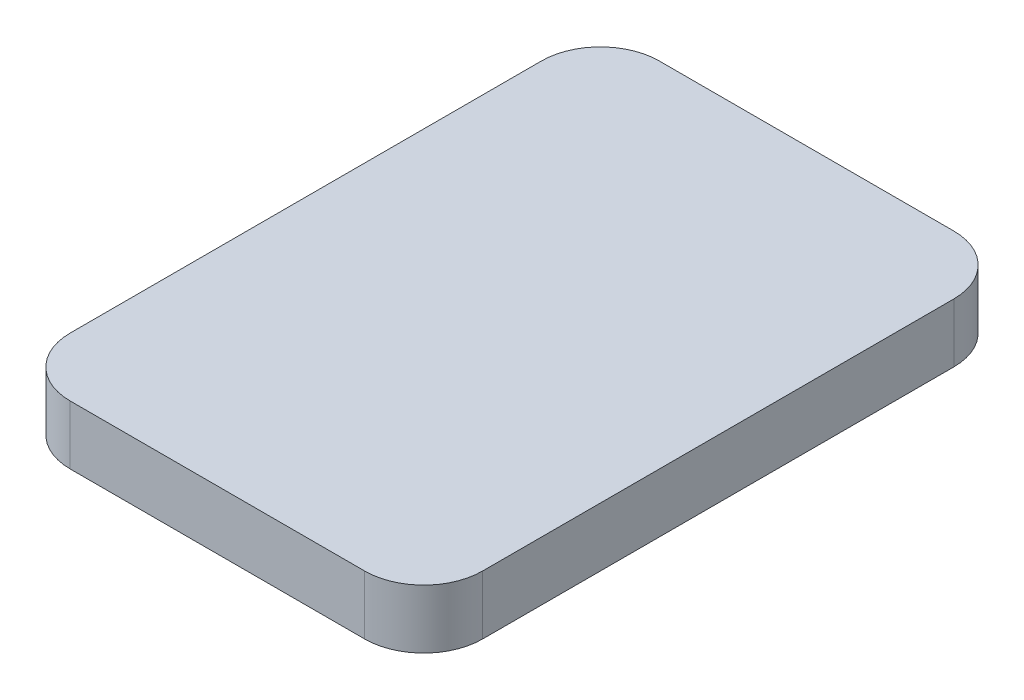
ISO-10303-21;
HEADER;
FILE_DESCRIPTION(('STEP AP214'),'2;1');
FILE_NAME('part.step','',(''),(''),'','','');
FILE_SCHEMA(('AUTOMOTIVE_DESIGN { 1 0 10303 214 1 1 1 1 }'));
ENDSEC;
DATA;
#1=APPLICATION_CONTEXT('core data for automotive mechanical design processes');
#2=APPLICATION_PROTOCOL_DEFINITION('international standard','automotive_design',2000,#1);
#3=PRODUCT_CONTEXT('',#1,'mechanical');
#4=PRODUCT('Part','Part','',(#3));
#5=PRODUCT_RELATED_PRODUCT_CATEGORY('part','',(#4));
#6=PRODUCT_DEFINITION_FORMATION('','',#4);
#7=PRODUCT_DEFINITION_CONTEXT('part definition',#1,'design');
#8=PRODUCT_DEFINITION('design','',#6,#7);
#9=PRODUCT_DEFINITION_SHAPE('','',#8);
#10=(LENGTH_UNIT() NAMED_UNIT(*) SI_UNIT(.MILLI.,.METRE.));
#11=(NAMED_UNIT(*) PLANE_ANGLE_UNIT() SI_UNIT($,.RADIAN.));
#12=(NAMED_UNIT(*) SI_UNIT($,.STERADIAN.) SOLID_ANGLE_UNIT());
#13=UNCERTAINTY_MEASURE_WITH_UNIT(LENGTH_MEASURE(1.E-05),#10,'distance_accuracy_value','');
#14=(GEOMETRIC_REPRESENTATION_CONTEXT(3) GLOBAL_UNCERTAINTY_ASSIGNED_CONTEXT((#13)) GLOBAL_UNIT_ASSIGNED_CONTEXT((#10,
#11,#12)) REPRESENTATION_CONTEXT('',''));
#15=CARTESIAN_POINT('',(0.,0.,0.));
#16=DIRECTION('',(0.,0.,1.));
#17=DIRECTION('',(1.,0.,0.));
#18=AXIS2_PLACEMENT_3D('',#15,#16,#17);
#19=CARTESIAN_POINT('',(0.,10.,100.));
#20=DIRECTION('',(1.,0.,0.));
#21=DIRECTION('',(0.,0.,-1.));
#22=AXIS2_PLACEMENT_3D('',#19,#20,#21);
#23=PLANE('',#22);
#24=DIRECTION('',(0.,0.,1.));
#25=VECTOR('',#24,1.);
#26=CARTESIAN_POINT('',(0.,10.,100.));
#27=LINE('',#26,#25);
#28=CARTESIAN_POINT('',(0.,10.,9.99999999999999));
#29=VERTEX_POINT('',#28);
#30=CARTESIAN_POINT('',(0.,10.,90.));
#31=VERTEX_POINT('',#30);
#32=EDGE_CURVE('E122',#29,#31,#27,.T.);
#33=ORIENTED_EDGE('',*,*,#32,.F.);
#34=DIRECTION('',(0.,-1.,0.));
#35=VECTOR('',#34,1.);
#36=CARTESIAN_POINT('',(0.,10.,9.99999999999999));
#37=LINE('',#36,#35);
#38=CARTESIAN_POINT('',(0.,0.,9.99999999999999));
#39=VERTEX_POINT('',#38);
#40=EDGE_CURVE('E107',#29,#39,#37,.T.);
#41=ORIENTED_EDGE('',*,*,#40,.T.);
#42=DIRECTION('',(0.,0.,1.));
#43=VECTOR('',#42,1.);
#44=CARTESIAN_POINT('',(0.,0.,100.));
#45=LINE('',#44,#43);
#46=CARTESIAN_POINT('',(0.,0.,90.));
#47=VERTEX_POINT('',#46);
#48=EDGE_CURVE('E119',#39,#47,#45,.T.);
#49=ORIENTED_EDGE('',*,*,#48,.T.);
#50=DIRECTION('',(0.,-1.,0.));
#51=VECTOR('',#50,1.);
#52=CARTESIAN_POINT('',(0.,10.,90.));
#53=LINE('',#52,#51);
#54=EDGE_CURVE('E124',#47,#31,#53,.F.);
#55=ORIENTED_EDGE('',*,*,#54,.T.);
#56=EDGE_LOOP('',(#33,#41,#49,#55));
#57=FACE_BOUND('',#56,.T.);
#58=ADVANCED_FACE('F36',(#57),#23,.F.);
#59=CARTESIAN_POINT('',(40.,10.,100.));
#60=DIRECTION('',(0.,0.,-1.));
#61=DIRECTION('',(-1.,0.,0.));
#62=AXIS2_PLACEMENT_3D('',#59,#60,#61);
#63=PLANE('',#62);
#64=DIRECTION('',(1.,0.,0.));
#65=VECTOR('',#64,1.);
#66=CARTESIAN_POINT('',(30.,10.,100.));
#67=LINE('',#66,#65);
#68=CARTESIAN_POINT('',(10.,10.,100.));
#69=VERTEX_POINT('',#68);
#70=CARTESIAN_POINT('',(60.,10.,100.));
#71=VERTEX_POINT('',#70);
#72=EDGE_CURVE('E162',#69,#71,#67,.T.);
#73=ORIENTED_EDGE('',*,*,#72,.F.);
#74=DIRECTION('',(0.,-1.,0.));
#75=VECTOR('',#74,1.);
#76=CARTESIAN_POINT('',(10.,10.,100.));
#77=LINE('',#76,#75);
#78=CARTESIAN_POINT('',(10.,0.,100.));
#79=VERTEX_POINT('',#78);
#80=EDGE_CURVE('E11',#69,#79,#77,.T.);
#81=ORIENTED_EDGE('',*,*,#80,.T.);
#82=DIRECTION('',(1.,0.,0.));
#83=VECTOR('',#82,1.);
#84=CARTESIAN_POINT('',(40.,0.,100.));
#85=LINE('',#84,#83);
#86=CARTESIAN_POINT('',(60.,0.,100.));
#87=VERTEX_POINT('',#86);
#88=EDGE_CURVE('E129',#79,#87,#85,.T.);
#89=ORIENTED_EDGE('',*,*,#88,.T.);
#90=DIRECTION('',(0.,-1.,0.));
#91=VECTOR('',#90,1.);
#92=CARTESIAN_POINT('',(60.,10.,100.));
#93=LINE('',#92,#91);
#94=EDGE_CURVE('E44',#87,#71,#93,.F.);
#95=ORIENTED_EDGE('',*,*,#94,.T.);
#96=EDGE_LOOP('',(#73,#81,#89,#95));
#97=FACE_BOUND('',#96,.T.);
#98=ADVANCED_FACE('F161',(#97),#63,.F.);
#99=CARTESIAN_POINT('',(70.,10.,100.));
#100=DIRECTION('',(-1.,0.,0.));
#101=DIRECTION('',(0.,0.,1.));
#102=AXIS2_PLACEMENT_3D('',#99,#100,#101);
#103=PLANE('',#102);
#104=DIRECTION('',(0.,0.,-1.));
#105=VECTOR('',#104,1.);
#106=CARTESIAN_POINT('',(70.,0.,100.));
#107=LINE('',#106,#105);
#108=CARTESIAN_POINT('',(70.,0.,90.));
#109=VERTEX_POINT('',#108);
#110=CARTESIAN_POINT('',(70.,0.,9.99999999999999));
#111=VERTEX_POINT('',#110);
#112=EDGE_CURVE('E132',#109,#111,#107,.T.);
#113=ORIENTED_EDGE('',*,*,#112,.T.);
#114=DIRECTION('',(0.,-1.,0.));
#115=VECTOR('',#114,1.);
#116=CARTESIAN_POINT('',(70.,10.,9.99999999999999));
#117=LINE('',#116,#115);
#118=CARTESIAN_POINT('',(70.,10.,9.99999999999999));
#119=VERTEX_POINT('',#118);
#120=EDGE_CURVE('E51',#111,#119,#117,.F.);
#121=ORIENTED_EDGE('',*,*,#120,.T.);
#122=DIRECTION('',(0.,0.,-1.));
#123=VECTOR('',#122,1.);
#124=CARTESIAN_POINT('',(70.,10.,100.));
#125=LINE('',#124,#123);
#126=CARTESIAN_POINT('',(70.,10.,90.));
#127=VERTEX_POINT('',#126);
#128=EDGE_CURVE('E168',#127,#119,#125,.T.);
#129=ORIENTED_EDGE('',*,*,#128,.F.);
#130=DIRECTION('',(0.,-1.,0.));
#131=VECTOR('',#130,1.);
#132=CARTESIAN_POINT('',(70.,10.,90.));
#133=LINE('',#132,#131);
#134=EDGE_CURVE('E155',#127,#109,#133,.T.);
#135=ORIENTED_EDGE('',*,*,#134,.T.);
#136=EDGE_LOOP('',(#113,#121,#129,#135));
#137=FACE_BOUND('',#136,.T.);
#138=ADVANCED_FACE('F172',(#137),#103,.F.);
#139=CARTESIAN_POINT('',(0.,10.,0.));
#140=DIRECTION('',(0.,0.,1.));
#141=DIRECTION('',(1.,0.,0.));
#142=AXIS2_PLACEMENT_3D('',#139,#140,#141);
#143=PLANE('',#142);
#144=DIRECTION('',(-1.,0.,0.));
#145=VECTOR('',#144,1.);
#146=CARTESIAN_POINT('',(0.,0.,0.));
#147=LINE('',#146,#145);
#148=CARTESIAN_POINT('',(60.,0.,0.));
#149=VERTEX_POINT('',#148);
#150=CARTESIAN_POINT('',(10.,0.,0.));
#151=VERTEX_POINT('',#150);
#152=EDGE_CURVE('E139',#149,#151,#147,.T.);
#153=ORIENTED_EDGE('',*,*,#152,.T.);
#154=DIRECTION('',(0.,-1.,0.));
#155=VECTOR('',#154,1.);
#156=CARTESIAN_POINT('',(10.,10.,0.));
#157=LINE('',#156,#155);
#158=CARTESIAN_POINT('',(10.,10.,0.));
#159=VERTEX_POINT('',#158);
#160=EDGE_CURVE('E108',#151,#159,#157,.F.);
#161=ORIENTED_EDGE('',*,*,#160,.T.);
#162=DIRECTION('',(-1.,0.,0.));
#163=VECTOR('',#162,1.);
#164=CARTESIAN_POINT('',(0.,10.,0.));
#165=LINE('',#164,#163);
#166=CARTESIAN_POINT('',(60.,10.,0.));
#167=VERTEX_POINT('',#166);
#168=EDGE_CURVE('E135',#167,#159,#165,.T.);
#169=ORIENTED_EDGE('',*,*,#168,.F.);
#170=DIRECTION('',(0.,-1.,0.));
#171=VECTOR('',#170,1.);
#172=CARTESIAN_POINT('',(60.,10.,0.));
#173=LINE('',#172,#171);
#174=EDGE_CURVE('E113',#167,#149,#173,.T.);
#175=ORIENTED_EDGE('',*,*,#174,.T.);
#176=EDGE_LOOP('',(#153,#161,#169,#175));
#177=FACE_BOUND('',#176,.T.);
#178=ADVANCED_FACE('F179',(#177),#143,.F.);
#179=CARTESIAN_POINT('',(0.,10.,0.));
#180=DIRECTION('',(0.,-1.,0.));
#181=DIRECTION('',(0.,0.,-1.));
#182=AXIS2_PLACEMENT_3D('',#179,#180,#181);
#183=PLANE('',#182);
#184=ORIENTED_EDGE('',*,*,#168,.T.);
#185=CARTESIAN_POINT('',(10.,10.,9.99999999999999));
#186=DIRECTION('',(0.,-1.,0.));
#187=DIRECTION('',(0.,0.,-1.));
#188=AXIS2_PLACEMENT_3D('',#185,#186,#187);
#189=CIRCLE('',#188,10.);
#190=EDGE_CURVE('E153',#159,#29,#189,.F.);
#191=ORIENTED_EDGE('',*,*,#190,.T.);
#192=ORIENTED_EDGE('',*,*,#32,.T.);
#193=CARTESIAN_POINT('',(10.,10.,90.));
#194=DIRECTION('',(0.,-1.,0.));
#195=DIRECTION('',(0.,0.,-1.));
#196=AXIS2_PLACEMENT_3D('',#193,#194,#195);
#197=CIRCLE('',#196,10.);
#198=EDGE_CURVE('E149',#31,#69,#197,.F.);
#199=ORIENTED_EDGE('',*,*,#198,.T.);
#200=ORIENTED_EDGE('',*,*,#72,.T.);
#201=CARTESIAN_POINT('',(60.,10.,90.));
#202=DIRECTION('',(0.,-1.,0.));
#203=DIRECTION('',(0.,0.,-1.));
#204=AXIS2_PLACEMENT_3D('',#201,#202,#203);
#205=CIRCLE('',#204,10.);
#206=EDGE_CURVE('E58',#71,#127,#205,.F.);
#207=ORIENTED_EDGE('',*,*,#206,.T.);
#208=ORIENTED_EDGE('',*,*,#128,.T.);
#209=CARTESIAN_POINT('',(60.,10.,9.99999999999999));
#210=DIRECTION('',(0.,-1.,0.));
#211=DIRECTION('',(0.,0.,-1.));
#212=AXIS2_PLACEMENT_3D('',#209,#210,#211);
#213=CIRCLE('',#212,10.);
#214=EDGE_CURVE('E151',#119,#167,#213,.F.);
#215=ORIENTED_EDGE('',*,*,#214,.T.);
#216=EDGE_LOOP('',(#184,#191,#192,#199,#200,#207,#208,#215));
#217=FACE_BOUND('',#216,.T.);
#218=ADVANCED_FACE('F166',(#217),#183,.F.);
#219=CARTESIAN_POINT('',(0.,0.,0.));
#220=DIRECTION('',(0.,-1.,0.));
#221=DIRECTION('',(0.,0.,-1.));
#222=AXIS2_PLACEMENT_3D('',#219,#220,#221);
#223=PLANE('',#222);
#224=ORIENTED_EDGE('',*,*,#48,.F.);
#225=CARTESIAN_POINT('',(10.,0.,9.99999999999999));
#226=DIRECTION('',(0.,-1.,0.));
#227=DIRECTION('',(0.,0.,-1.));
#228=AXIS2_PLACEMENT_3D('',#225,#226,#227);
#229=CIRCLE('',#228,10.);
#230=EDGE_CURVE('E103',#39,#151,#229,.T.);
#231=ORIENTED_EDGE('',*,*,#230,.T.);
#232=ORIENTED_EDGE('',*,*,#152,.F.);
#233=CARTESIAN_POINT('',(60.,0.,9.99999999999999));
#234=DIRECTION('',(0.,-1.,0.));
#235=DIRECTION('',(0.,0.,-1.));
#236=AXIS2_PLACEMENT_3D('',#233,#234,#235);
#237=CIRCLE('',#236,10.);
#238=EDGE_CURVE('E114',#149,#111,#237,.T.);
#239=ORIENTED_EDGE('',*,*,#238,.T.);
#240=ORIENTED_EDGE('',*,*,#112,.F.);
#241=CARTESIAN_POINT('',(60.,0.,90.));
#242=DIRECTION('',(0.,-1.,0.));
#243=DIRECTION('',(0.,0.,-1.));
#244=AXIS2_PLACEMENT_3D('',#241,#242,#243);
#245=CIRCLE('',#244,10.);
#246=EDGE_CURVE('E123',#109,#87,#245,.T.);
#247=ORIENTED_EDGE('',*,*,#246,.T.);
#248=ORIENTED_EDGE('',*,*,#88,.F.);
#249=CARTESIAN_POINT('',(10.,0.,90.));
#250=DIRECTION('',(0.,-1.,0.));
#251=DIRECTION('',(0.,0.,-1.));
#252=AXIS2_PLACEMENT_3D('',#249,#250,#251);
#253=CIRCLE('',#252,10.);
#254=EDGE_CURVE('E128',#79,#47,#253,.T.);
#255=ORIENTED_EDGE('',*,*,#254,.T.);
#256=EDGE_LOOP('',(#224,#231,#232,#239,#240,#247,#248,#255));
#257=FACE_BOUND('',#256,.T.);
#258=ADVANCED_FACE('F126',(#257),#223,.T.);
#259=CARTESIAN_POINT('',(10.,10.,9.99999999999999));
#260=DIRECTION('',(0.,-1.,0.));
#261=DIRECTION('',(0.,0.,-1.));
#262=AXIS2_PLACEMENT_3D('',#259,#260,#261);
#263=CYLINDRICAL_SURFACE('',#262,10.);
#264=ORIENTED_EDGE('',*,*,#190,.F.);
#265=ORIENTED_EDGE('',*,*,#160,.F.);
#266=ORIENTED_EDGE('',*,*,#230,.F.);
#267=ORIENTED_EDGE('',*,*,#40,.F.);
#268=EDGE_LOOP('',(#264,#265,#266,#267));
#269=FACE_BOUND('',#268,.T.);
#270=ADVANCED_FACE('F106',(#269),#263,.T.);
#271=CARTESIAN_POINT('',(60.,10.,9.99999999999999));
#272=DIRECTION('',(0.,-1.,0.));
#273=DIRECTION('',(0.,0.,-1.));
#274=AXIS2_PLACEMENT_3D('',#271,#272,#273);
#275=CYLINDRICAL_SURFACE('',#274,10.);
#276=ORIENTED_EDGE('',*,*,#214,.F.);
#277=ORIENTED_EDGE('',*,*,#120,.F.);
#278=ORIENTED_EDGE('',*,*,#238,.F.);
#279=ORIENTED_EDGE('',*,*,#174,.F.);
#280=EDGE_LOOP('',(#276,#277,#278,#279));
#281=FACE_BOUND('',#280,.T.);
#282=ADVANCED_FACE('F176',(#281),#275,.T.);
#283=CARTESIAN_POINT('',(10.,10.,90.));
#284=DIRECTION('',(0.,-1.,0.));
#285=DIRECTION('',(0.,0.,-1.));
#286=AXIS2_PLACEMENT_3D('',#283,#284,#285);
#287=CYLINDRICAL_SURFACE('',#286,10.);
#288=ORIENTED_EDGE('',*,*,#198,.F.);
#289=ORIENTED_EDGE('',*,*,#54,.F.);
#290=ORIENTED_EDGE('',*,*,#254,.F.);
#291=ORIENTED_EDGE('',*,*,#80,.F.);
#292=EDGE_LOOP('',(#288,#289,#290,#291));
#293=FACE_BOUND('',#292,.T.);
#294=ADVANCED_FACE('F182',(#293),#287,.T.);
#295=CARTESIAN_POINT('',(60.,10.,90.));
#296=DIRECTION('',(0.,-1.,0.));
#297=DIRECTION('',(0.,0.,-1.));
#298=AXIS2_PLACEMENT_3D('',#295,#296,#297);
#299=CYLINDRICAL_SURFACE('',#298,10.);
#300=ORIENTED_EDGE('',*,*,#206,.F.);
#301=ORIENTED_EDGE('',*,*,#94,.F.);
#302=ORIENTED_EDGE('',*,*,#246,.F.);
#303=ORIENTED_EDGE('',*,*,#134,.F.);
#304=EDGE_LOOP('',(#300,#301,#302,#303));
#305=FACE_BOUND('',#304,.T.);
#306=ADVANCED_FACE('F38',(#305),#299,.T.);
#307=CLOSED_SHELL('',(#58,#98,#138,#178,#218,#258,#270,#282,#294,#306));
#308=MANIFOLD_SOLID_BREP('B2',#307);
#309=ADVANCED_BREP_SHAPE_REPRESENTATION('',(#18,#308),#14);
#310=SHAPE_DEFINITION_REPRESENTATION(#9,#309);
ENDSEC;
END-ISO-10303-21;
